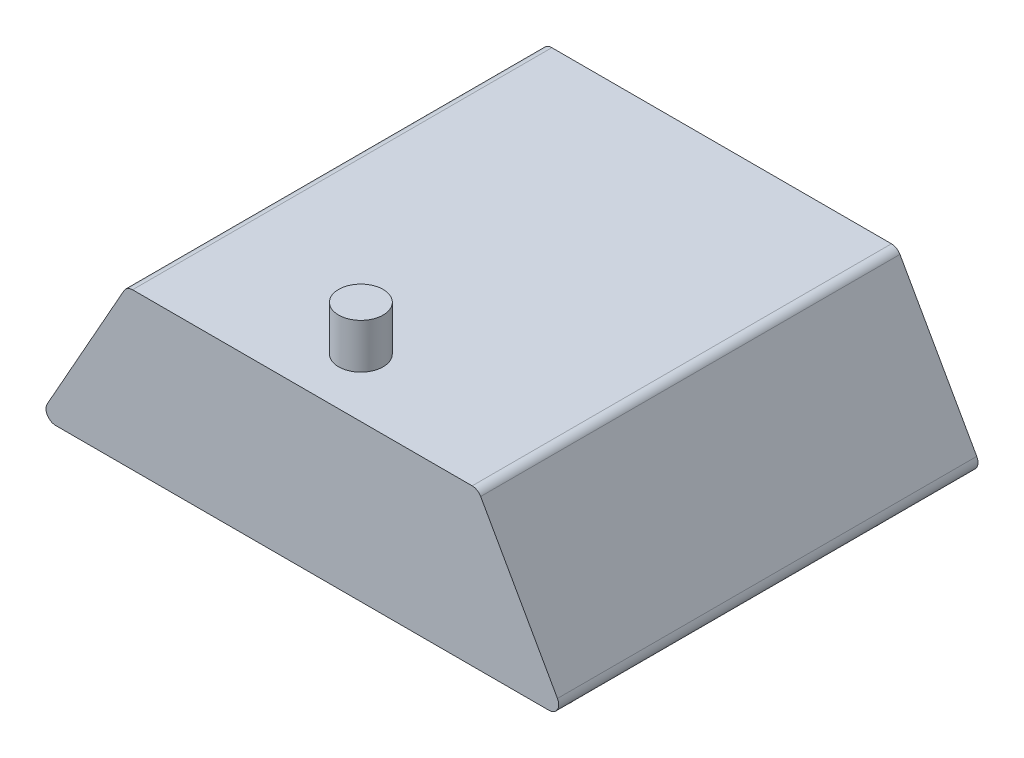
ISO-10303-21;
HEADER;
FILE_DESCRIPTION(('STEP AP214'),'2;1');
FILE_NAME('part.step','',(''),(''),'','','');
FILE_SCHEMA(('AUTOMOTIVE_DESIGN { 1 0 10303 214 1 1 1 1 }'));
ENDSEC;
DATA;
#1=APPLICATION_CONTEXT('core data for automotive mechanical design processes');
#2=APPLICATION_PROTOCOL_DEFINITION('international standard','automotive_design',2000,#1);
#3=PRODUCT_CONTEXT('',#1,'mechanical');
#4=PRODUCT('Part','Part','',(#3));
#5=PRODUCT_RELATED_PRODUCT_CATEGORY('part','',(#4));
#6=PRODUCT_DEFINITION_FORMATION('','',#4);
#7=PRODUCT_DEFINITION_CONTEXT('part definition',#1,'design');
#8=PRODUCT_DEFINITION('design','',#6,#7);
#9=PRODUCT_DEFINITION_SHAPE('','',#8);
#10=(LENGTH_UNIT() NAMED_UNIT(*) SI_UNIT(.MILLI.,.METRE.));
#11=(NAMED_UNIT(*) PLANE_ANGLE_UNIT() SI_UNIT($,.RADIAN.));
#12=(NAMED_UNIT(*) SI_UNIT($,.STERADIAN.) SOLID_ANGLE_UNIT());
#13=UNCERTAINTY_MEASURE_WITH_UNIT(LENGTH_MEASURE(1.E-05),#10,'distance_accuracy_value','');
#14=(GEOMETRIC_REPRESENTATION_CONTEXT(3) GLOBAL_UNCERTAINTY_ASSIGNED_CONTEXT((#13)) GLOBAL_UNIT_ASSIGNED_CONTEXT((#10,
#11,#12)) REPRESENTATION_CONTEXT('',''));
#15=CARTESIAN_POINT('',(0.,0.,0.));
#16=DIRECTION('',(0.,0.,1.));
#17=DIRECTION('',(1.,0.,0.));
#18=AXIS2_PLACEMENT_3D('',#15,#16,#17);
#19=CARTESIAN_POINT('',(-126.450762577911,-35.,215.));
#20=DIRECTION('',(0.,0.,-1.));
#21=DIRECTION('',(-1.,0.,0.));
#22=AXIS2_PLACEMENT_3D('',#19,#20,#21);
#23=CYLINDRICAL_SURFACE('',#22,5.00000000000003);
#24=CARTESIAN_POINT('',(-126.450762577911,-35.,0.));
#25=DIRECTION('',(0.,0.,1.));
#26=DIRECTION('',(1.,0.,0.));
#27=AXIS2_PLACEMENT_3D('',#24,#25,#26);
#28=CIRCLE('',#27,5.00000000000003);
#29=CARTESIAN_POINT('',(-130.808640263533,-32.5486938018372,0.));
#30=VERTEX_POINT('',#29);
#31=CARTESIAN_POINT('',(-126.450762577911,-40.,0.));
#32=VERTEX_POINT('',#31);
#33=EDGE_CURVE('E143',#30,#32,#28,.T.);
#34=ORIENTED_EDGE('',*,*,#33,.T.);
#35=DIRECTION('',(0.,0.,-1.));
#36=VECTOR('',#35,1.);
#37=CARTESIAN_POINT('',(-126.450762577911,-40.,215.));
#38=LINE('',#37,#36);
#39=CARTESIAN_POINT('',(-126.450762577911,-40.,215.));
#40=VERTEX_POINT('',#39);
#41=EDGE_CURVE('E185',#40,#32,#38,.T.);
#42=ORIENTED_EDGE('',*,*,#41,.F.);
#43=CARTESIAN_POINT('',(-126.450762577911,-35.,215.));
#44=DIRECTION('',(0.,0.,1.));
#45=DIRECTION('',(1.,0.,0.));
#46=AXIS2_PLACEMENT_3D('',#43,#44,#45);
#47=CIRCLE('',#46,5.00000000000003);
#48=CARTESIAN_POINT('',(-130.808640263533,-32.5486938018372,215.));
#49=VERTEX_POINT('',#48);
#50=EDGE_CURVE('E166',#49,#40,#47,.T.);
#51=ORIENTED_EDGE('',*,*,#50,.F.);
#52=DIRECTION('',(0.,0.,-1.));
#53=VECTOR('',#52,1.);
#54=CARTESIAN_POINT('',(-130.808640263533,-32.5486938018372,215.));
#55=LINE('',#54,#53);
#56=EDGE_CURVE('E139',#49,#30,#55,.T.);
#57=ORIENTED_EDGE('',*,*,#56,.T.);
#58=EDGE_LOOP('',(#34,#42,#51,#57));
#59=FACE_BOUND('',#58,.T.);
#60=ADVANCED_FACE('F41',(#59),#23,.T.);
#61=CARTESIAN_POINT('',(-126.450762577911,-40.,215.));
#62=DIRECTION('',(0.,1.,0.));
#63=DIRECTION('',(0.,0.,1.));
#64=AXIS2_PLACEMENT_3D('',#61,#62,#63);
#65=PLANE('',#64);
#66=CARTESIAN_POINT('',(100.,-40.,29.01));
#67=DIRECTION('',(0.,1.,0.));
#68=DIRECTION('',(0.,0.,1.));
#69=AXIS2_PLACEMENT_3D('',#66,#67,#68);
#70=CIRCLE('',#69,12.5);
#71=CARTESIAN_POINT('',(100.,-40.,41.51));
#72=VERTEX_POINT('',#71);
#73=EDGE_CURVE('E11',#72,#72,#70,.F.);
#74=ORIENTED_EDGE('',*,*,#73,.F.);
#75=EDGE_LOOP('',(#74));
#76=FACE_BOUND('',#75,.T.);
#77=CARTESIAN_POINT('',(100.,-40.,185.99));
#78=DIRECTION('',(0.,1.,0.));
#79=DIRECTION('',(0.,0.,1.));
#80=AXIS2_PLACEMENT_3D('',#77,#78,#79);
#81=CIRCLE('',#80,12.5);
#82=CARTESIAN_POINT('',(100.,-40.,198.49));
#83=VERTEX_POINT('',#82);
#84=EDGE_CURVE('E50',#83,#83,#81,.F.);
#85=ORIENTED_EDGE('',*,*,#84,.F.);
#86=EDGE_LOOP('',(#85));
#87=FACE_BOUND('',#86,.T.);
#88=CARTESIAN_POINT('',(-100.,-40.,185.99));
#89=DIRECTION('',(0.,1.,0.));
#90=DIRECTION('',(0.,0.,1.));
#91=AXIS2_PLACEMENT_3D('',#88,#89,#90);
#92=CIRCLE('',#91,12.5);
#93=CARTESIAN_POINT('',(-100.,-40.,198.49));
#94=VERTEX_POINT('',#93);
#95=EDGE_CURVE('E196',#94,#94,#92,.F.);
#96=ORIENTED_EDGE('',*,*,#95,.F.);
#97=EDGE_LOOP('',(#96));
#98=FACE_BOUND('',#97,.T.);
#99=CARTESIAN_POINT('',(-100.,-40.,29.01));
#100=DIRECTION('',(0.,1.,0.));
#101=DIRECTION('',(0.,0.,1.));
#102=AXIS2_PLACEMENT_3D('',#99,#100,#101);
#103=CIRCLE('',#102,12.5);
#104=CARTESIAN_POINT('',(-100.,-40.,41.51));
#105=VERTEX_POINT('',#104);
#106=EDGE_CURVE('E192',#105,#105,#103,.F.);
#107=ORIENTED_EDGE('',*,*,#106,.F.);
#108=EDGE_LOOP('',(#107));
#109=FACE_BOUND('',#108,.T.);
#110=DIRECTION('',(1.,0.,0.));
#111=VECTOR('',#110,1.);
#112=CARTESIAN_POINT('',(-126.450762577911,-40.,0.));
#113=LINE('',#112,#111);
#114=CARTESIAN_POINT('',(126.450762577911,-40.,0.));
#115=VERTEX_POINT('',#114);
#116=EDGE_CURVE('E147',#32,#115,#113,.T.);
#117=ORIENTED_EDGE('',*,*,#116,.T.);
#118=DIRECTION('',(0.,0.,-1.));
#119=VECTOR('',#118,1.);
#120=CARTESIAN_POINT('',(126.450762577911,-40.,215.));
#121=LINE('',#120,#119);
#122=CARTESIAN_POINT('',(126.450762577911,-40.,215.));
#123=VERTEX_POINT('',#122);
#124=EDGE_CURVE('E181',#123,#115,#121,.T.);
#125=ORIENTED_EDGE('',*,*,#124,.F.);
#126=DIRECTION('',(1.,0.,0.));
#127=VECTOR('',#126,1.);
#128=CARTESIAN_POINT('',(-126.450762577911,-40.,215.));
#129=LINE('',#128,#127);
#130=EDGE_CURVE('E102',#40,#123,#129,.T.);
#131=ORIENTED_EDGE('',*,*,#130,.F.);
#132=ORIENTED_EDGE('',*,*,#41,.T.);
#133=EDGE_LOOP('',(#117,#125,#131,#132));
#134=FACE_BOUND('',#133,.T.);
#135=ADVANCED_FACE('F205',(#76,#87,#98,#109,#134),#65,.F.);
#136=CARTESIAN_POINT('',(126.450762577911,-35.,215.));
#137=DIRECTION('',(0.,0.,-1.));
#138=DIRECTION('',(-1.,0.,0.));
#139=AXIS2_PLACEMENT_3D('',#136,#137,#138);
#140=CYLINDRICAL_SURFACE('',#139,5.);
#141=CARTESIAN_POINT('',(126.450762577911,-35.,0.));
#142=DIRECTION('',(0.,0.,1.));
#143=DIRECTION('',(1.,0.,0.));
#144=AXIS2_PLACEMENT_3D('',#141,#142,#143);
#145=CIRCLE('',#144,5.);
#146=CARTESIAN_POINT('',(130.808640263533,-32.5486938018372,0.));
#147=VERTEX_POINT('',#146);
#148=EDGE_CURVE('E151',#115,#147,#145,.T.);
#149=ORIENTED_EDGE('',*,*,#148,.T.);
#150=DIRECTION('',(0.,0.,-1.));
#151=VECTOR('',#150,1.);
#152=CARTESIAN_POINT('',(130.808640263533,-32.5486938018372,215.));
#153=LINE('',#152,#151);
#154=CARTESIAN_POINT('',(130.808640263533,-32.5486938018372,215.));
#155=VERTEX_POINT('',#154);
#156=EDGE_CURVE('E177',#155,#147,#153,.T.);
#157=ORIENTED_EDGE('',*,*,#156,.F.);
#158=CARTESIAN_POINT('',(126.450762577911,-35.,215.));
#159=DIRECTION('',(0.,0.,1.));
#160=DIRECTION('',(1.,0.,0.));
#161=AXIS2_PLACEMENT_3D('',#158,#159,#160);
#162=CIRCLE('',#161,5.);
#163=EDGE_CURVE('E220',#123,#155,#162,.T.);
#164=ORIENTED_EDGE('',*,*,#163,.F.);
#165=ORIENTED_EDGE('',*,*,#124,.T.);
#166=EDGE_LOOP('',(#149,#157,#164,#165));
#167=FACE_BOUND('',#166,.T.);
#168=ADVANCED_FACE('F208',(#167),#140,.T.);
#169=CARTESIAN_POINT('',(91.4336402635334,37.4513061981628,215.));
#170=DIRECTION('',(-0.871575537124549,-0.490261239632559,0.));
#171=DIRECTION('',(0.490261239632559,-0.871575537124549,0.));
#172=AXIS2_PLACEMENT_3D('',#169,#170,#171);
#173=PLANE('',#172);
#174=DIRECTION('',(-0.490261239632559,0.871575537124549,0.));
#175=VECTOR('',#174,1.);
#176=CARTESIAN_POINT('',(91.4336402635334,37.4513061981628,0.));
#177=LINE('',#176,#175);
#178=CARTESIAN_POINT('',(91.4336402635334,37.4513061981628,0.));
#179=VERTEX_POINT('',#178);
#180=EDGE_CURVE('E154',#147,#179,#177,.T.);
#181=ORIENTED_EDGE('',*,*,#180,.T.);
#182=DIRECTION('',(0.,0.,-1.));
#183=VECTOR('',#182,1.);
#184=CARTESIAN_POINT('',(91.4336402635334,37.4513061981628,215.));
#185=LINE('',#184,#183);
#186=CARTESIAN_POINT('',(91.4336402635334,37.4513061981628,215.));
#187=VERTEX_POINT('',#186);
#188=EDGE_CURVE('E173',#187,#179,#185,.T.);
#189=ORIENTED_EDGE('',*,*,#188,.F.);
#190=DIRECTION('',(-0.490261239632559,0.871575537124549,0.));
#191=VECTOR('',#190,1.);
#192=CARTESIAN_POINT('',(91.4336402635334,37.4513061981628,215.));
#193=LINE('',#192,#191);
#194=EDGE_CURVE('E231',#155,#187,#193,.T.);
#195=ORIENTED_EDGE('',*,*,#194,.F.);
#196=ORIENTED_EDGE('',*,*,#156,.T.);
#197=EDGE_LOOP('',(#181,#189,#195,#196));
#198=FACE_BOUND('',#197,.T.);
#199=ADVANCED_FACE('F226',(#198),#173,.F.);
#200=CARTESIAN_POINT('',(87.0757625779107,35.,215.));
#201=DIRECTION('',(0.,0.,-1.));
#202=DIRECTION('',(-1.,0.,0.));
#203=AXIS2_PLACEMENT_3D('',#200,#201,#202);
#204=CYLINDRICAL_SURFACE('',#203,5.00000000000002);
#205=CARTESIAN_POINT('',(87.0757625779107,35.,0.));
#206=DIRECTION('',(0.,0.,1.));
#207=DIRECTION('',(-1.,0.,0.));
#208=AXIS2_PLACEMENT_3D('',#205,#206,#207);
#209=CIRCLE('',#208,5.00000000000002);
#210=CARTESIAN_POINT('',(87.0757625779107,40.,0.));
#211=VERTEX_POINT('',#210);
#212=EDGE_CURVE('E157',#179,#211,#209,.T.);
#213=ORIENTED_EDGE('',*,*,#212,.T.);
#214=DIRECTION('',(0.,0.,-1.));
#215=VECTOR('',#214,1.);
#216=CARTESIAN_POINT('',(87.0757625779107,40.,215.));
#217=LINE('',#216,#215);
#218=CARTESIAN_POINT('',(87.0757625779107,40.,215.));
#219=VERTEX_POINT('',#218);
#220=EDGE_CURVE('E132',#219,#211,#217,.T.);
#221=ORIENTED_EDGE('',*,*,#220,.F.);
#222=CARTESIAN_POINT('',(87.0757625779107,35.,215.));
#223=DIRECTION('',(0.,0.,1.));
#224=DIRECTION('',(-1.,0.,0.));
#225=AXIS2_PLACEMENT_3D('',#222,#223,#224);
#226=CIRCLE('',#225,5.00000000000002);
#227=EDGE_CURVE('E121',#187,#219,#226,.T.);
#228=ORIENTED_EDGE('',*,*,#227,.F.);
#229=ORIENTED_EDGE('',*,*,#188,.T.);
#230=EDGE_LOOP('',(#213,#221,#228,#229));
#231=FACE_BOUND('',#230,.T.);
#232=ADVANCED_FACE('F229',(#231),#204,.T.);
#233=CARTESIAN_POINT('',(-87.0757625779107,40.,215.));
#234=DIRECTION('',(0.,-1.,0.));
#235=DIRECTION('',(0.,0.,-1.));
#236=AXIS2_PLACEMENT_3D('',#233,#234,#235);
#237=PLANE('',#236);
#238=CARTESIAN_POINT('',(0.,40.,185.));
#239=DIRECTION('',(0.,-1.,0.));
#240=DIRECTION('',(0.,0.,-1.));
#241=AXIS2_PLACEMENT_3D('',#238,#239,#240);
#242=CIRCLE('',#241,11.405);
#243=CARTESIAN_POINT('',(0.,40.,173.595));
#244=VERTEX_POINT('',#243);
#245=EDGE_CURVE('E188',#244,#244,#242,.F.);
#246=ORIENTED_EDGE('',*,*,#245,.F.);
#247=EDGE_LOOP('',(#246));
#248=FACE_BOUND('',#247,.T.);
#249=DIRECTION('',(-1.,0.,0.));
#250=VECTOR('',#249,1.);
#251=CARTESIAN_POINT('',(-87.0757625779107,40.,0.));
#252=LINE('',#251,#250);
#253=CARTESIAN_POINT('',(-87.0757625779107,40.,0.));
#254=VERTEX_POINT('',#253);
#255=EDGE_CURVE('E130',#211,#254,#252,.T.);
#256=ORIENTED_EDGE('',*,*,#255,.T.);
#257=DIRECTION('',(0.,0.,-1.));
#258=VECTOR('',#257,1.);
#259=CARTESIAN_POINT('',(-87.0757625779107,40.,215.));
#260=LINE('',#259,#258);
#261=CARTESIAN_POINT('',(-87.0757625779107,40.,215.));
#262=VERTEX_POINT('',#261);
#263=EDGE_CURVE('E127',#262,#254,#260,.T.);
#264=ORIENTED_EDGE('',*,*,#263,.F.);
#265=DIRECTION('',(-1.,0.,0.));
#266=VECTOR('',#265,1.);
#267=CARTESIAN_POINT('',(-87.0757625779107,40.,215.));
#268=LINE('',#267,#266);
#269=EDGE_CURVE('E115',#219,#262,#268,.T.);
#270=ORIENTED_EDGE('',*,*,#269,.F.);
#271=ORIENTED_EDGE('',*,*,#220,.T.);
#272=EDGE_LOOP('',(#256,#264,#270,#271));
#273=FACE_BOUND('',#272,.T.);
#274=ADVANCED_FACE('F128',(#248,#273),#237,.F.);
#275=CARTESIAN_POINT('',(-87.0757625779107,35.,215.));
#276=DIRECTION('',(0.,0.,-1.));
#277=DIRECTION('',(-1.,0.,0.));
#278=AXIS2_PLACEMENT_3D('',#275,#276,#277);
#279=CYLINDRICAL_SURFACE('',#278,4.99999999999999);
#280=CARTESIAN_POINT('',(-87.0757625779107,35.,0.));
#281=DIRECTION('',(0.,0.,1.));
#282=DIRECTION('',(-1.,0.,0.));
#283=AXIS2_PLACEMENT_3D('',#280,#281,#282);
#284=CIRCLE('',#283,4.99999999999999);
#285=CARTESIAN_POINT('',(-91.4336402635334,37.4513061981628,0.));
#286=VERTEX_POINT('',#285);
#287=EDGE_CURVE('E87',#254,#286,#284,.T.);
#288=ORIENTED_EDGE('',*,*,#287,.T.);
#289=DIRECTION('',(0.,0.,-1.));
#290=VECTOR('',#289,1.);
#291=CARTESIAN_POINT('',(-91.4336402635334,37.4513061981628,215.));
#292=LINE('',#291,#290);
#293=CARTESIAN_POINT('',(-91.4336402635334,37.4513061981628,215.));
#294=VERTEX_POINT('',#293);
#295=EDGE_CURVE('E133',#294,#286,#292,.T.);
#296=ORIENTED_EDGE('',*,*,#295,.F.);
#297=CARTESIAN_POINT('',(-87.0757625779107,35.,215.));
#298=DIRECTION('',(0.,0.,1.));
#299=DIRECTION('',(-1.,0.,0.));
#300=AXIS2_PLACEMENT_3D('',#297,#298,#299);
#301=CIRCLE('',#300,4.99999999999999);
#302=EDGE_CURVE('E119',#262,#294,#301,.T.);
#303=ORIENTED_EDGE('',*,*,#302,.F.);
#304=ORIENTED_EDGE('',*,*,#263,.T.);
#305=EDGE_LOOP('',(#288,#296,#303,#304));
#306=FACE_BOUND('',#305,.T.);
#307=ADVANCED_FACE('F135',(#306),#279,.T.);
#308=CARTESIAN_POINT('',(-91.4336402635334,37.4513061981628,215.));
#309=DIRECTION('',(0.871575537124549,-0.490261239632559,0.));
#310=DIRECTION('',(0.490261239632559,0.871575537124549,0.));
#311=AXIS2_PLACEMENT_3D('',#308,#309,#310);
#312=PLANE('',#311);
#313=DIRECTION('',(-0.490261239632559,-0.871575537124549,0.));
#314=VECTOR('',#313,1.);
#315=CARTESIAN_POINT('',(-91.4336402635334,37.4513061981628,0.));
#316=LINE('',#315,#314);
#317=EDGE_CURVE('E93',#286,#30,#316,.T.);
#318=ORIENTED_EDGE('',*,*,#317,.T.);
#319=ORIENTED_EDGE('',*,*,#56,.F.);
#320=DIRECTION('',(-0.490261239632559,-0.871575537124549,0.));
#321=VECTOR('',#320,1.);
#322=CARTESIAN_POINT('',(-91.4336402635334,37.4513061981628,215.));
#323=LINE('',#322,#321);
#324=EDGE_CURVE('E58',#294,#49,#323,.T.);
#325=ORIENTED_EDGE('',*,*,#324,.F.);
#326=ORIENTED_EDGE('',*,*,#295,.T.);
#327=EDGE_LOOP('',(#318,#319,#325,#326));
#328=FACE_BOUND('',#327,.T.);
#329=ADVANCED_FACE('F284',(#328),#312,.F.);
#330=CARTESIAN_POINT('',(-126.450762577911,-35.,215.));
#331=DIRECTION('',(0.,0.,1.));
#332=DIRECTION('',(1.,0.,0.));
#333=AXIS2_PLACEMENT_3D('',#330,#331,#332);
#334=PLANE('',#333);
#335=ORIENTED_EDGE('',*,*,#50,.T.);
#336=ORIENTED_EDGE('',*,*,#130,.T.);
#337=ORIENTED_EDGE('',*,*,#163,.T.);
#338=ORIENTED_EDGE('',*,*,#194,.T.);
#339=ORIENTED_EDGE('',*,*,#227,.T.);
#340=ORIENTED_EDGE('',*,*,#269,.T.);
#341=ORIENTED_EDGE('',*,*,#302,.T.);
#342=ORIENTED_EDGE('',*,*,#324,.T.);
#343=EDGE_LOOP('',(#335,#336,#337,#338,#339,#340,#341,#342));
#344=FACE_BOUND('',#343,.T.);
#345=ADVANCED_FACE('F117',(#344),#334,.T.);
#346=CARTESIAN_POINT('',(-126.450762577911,-35.,0.));
#347=DIRECTION('',(0.,0.,1.));
#348=DIRECTION('',(1.,0.,0.));
#349=AXIS2_PLACEMENT_3D('',#346,#347,#348);
#350=PLANE('',#349);
#351=ORIENTED_EDGE('',*,*,#33,.F.);
#352=ORIENTED_EDGE('',*,*,#317,.F.);
#353=ORIENTED_EDGE('',*,*,#287,.F.);
#354=ORIENTED_EDGE('',*,*,#255,.F.);
#355=ORIENTED_EDGE('',*,*,#212,.F.);
#356=ORIENTED_EDGE('',*,*,#180,.F.);
#357=ORIENTED_EDGE('',*,*,#148,.F.);
#358=ORIENTED_EDGE('',*,*,#116,.F.);
#359=EDGE_LOOP('',(#351,#352,#353,#354,#355,#356,#357,#358));
#360=FACE_BOUND('',#359,.T.);
#361=ADVANCED_FACE('F222',(#360),#350,.F.);
#362=CARTESIAN_POINT('',(0.,60.,185.));
#363=DIRECTION('',(0.,-1.,0.));
#364=DIRECTION('',(0.,0.,-1.));
#365=AXIS2_PLACEMENT_3D('',#362,#363,#364);
#366=CYLINDRICAL_SURFACE('',#365,11.405);
#367=ORIENTED_EDGE('',*,*,#245,.T.);
#368=EDGE_LOOP('',(#367));
#369=FACE_BOUND('',#368,.T.);
#370=CARTESIAN_POINT('',(0.,63.,185.));
#371=DIRECTION('',(0.,1.,0.));
#372=DIRECTION('',(0.,0.,1.));
#373=AXIS2_PLACEMENT_3D('',#370,#371,#372);
#374=CIRCLE('',#373,11.405);
#375=CARTESIAN_POINT('',(0.,63.,196.405));
#376=VERTEX_POINT('',#375);
#377=EDGE_CURVE('E256',#376,#376,#374,.T.);
#378=ORIENTED_EDGE('',*,*,#377,.F.);
#379=EDGE_LOOP('',(#378));
#380=FACE_BOUND('',#379,.T.);
#381=ADVANCED_FACE('F263',(#369,#380),#366,.T.);
#382=CARTESIAN_POINT('',(-100.,-40.,29.01));
#383=DIRECTION('',(0.,1.,0.));
#384=DIRECTION('',(0.,0.,-1.));
#385=AXIS2_PLACEMENT_3D('',#382,#383,#384);
#386=CONICAL_SURFACE('',#385,12.5,0.191986217719377);
#387=CARTESIAN_POINT('',(-100.,-60.,29.01));
#388=DIRECTION('',(0.,-1.,0.));
#389=DIRECTION('',(0.,0.,-1.));
#390=AXIS2_PLACEMENT_3D('',#387,#388,#389);
#391=CIRCLE('',#390,8.61239381724562);
#392=CARTESIAN_POINT('',(-100.,-60.,20.3976061827544));
#393=VERTEX_POINT('',#392);
#394=EDGE_CURVE('E148',#393,#393,#391,.T.);
#395=ORIENTED_EDGE('',*,*,#394,.F.);
#396=EDGE_LOOP('',(#395));
#397=FACE_BOUND('',#396,.T.);
#398=ORIENTED_EDGE('',*,*,#106,.T.);
#399=EDGE_LOOP('',(#398));
#400=FACE_BOUND('',#399,.T.);
#401=ADVANCED_FACE('F265',(#397,#400),#386,.T.);
#402=CARTESIAN_POINT('',(0.,-60.,0.));
#403=DIRECTION('',(0.,-1.,0.));
#404=DIRECTION('',(0.,0.,-1.));
#405=AXIS2_PLACEMENT_3D('',#402,#403,#404);
#406=PLANE('',#405);
#407=ORIENTED_EDGE('',*,*,#394,.T.);
#408=EDGE_LOOP('',(#407));
#409=FACE_BOUND('',#408,.T.);
#410=ADVANCED_FACE('F273',(#409),#406,.T.);
#411=CARTESIAN_POINT('',(-100.,-40.,185.99));
#412=DIRECTION('',(0.,1.,0.));
#413=DIRECTION('',(0.,0.,-1.));
#414=AXIS2_PLACEMENT_3D('',#411,#412,#413);
#415=CONICAL_SURFACE('',#414,12.5,0.191986217719377);
#416=CARTESIAN_POINT('',(-100.,-60.,185.99));
#417=DIRECTION('',(0.,-1.,0.));
#418=DIRECTION('',(0.,0.,-1.));
#419=AXIS2_PLACEMENT_3D('',#416,#417,#418);
#420=CIRCLE('',#419,8.61239381724563);
#421=CARTESIAN_POINT('',(-100.,-60.,177.377606182754));
#422=VERTEX_POINT('',#421);
#423=EDGE_CURVE('E244',#422,#422,#420,.T.);
#424=ORIENTED_EDGE('',*,*,#423,.F.);
#425=EDGE_LOOP('',(#424));
#426=FACE_BOUND('',#425,.T.);
#427=ORIENTED_EDGE('',*,*,#95,.T.);
#428=EDGE_LOOP('',(#427));
#429=FACE_BOUND('',#428,.T.);
#430=ADVANCED_FACE('F350',(#426,#429),#415,.T.);
#431=CARTESIAN_POINT('',(0.,-60.,0.));
#432=DIRECTION('',(0.,-1.,0.));
#433=DIRECTION('',(0.,0.,-1.));
#434=AXIS2_PLACEMENT_3D('',#431,#432,#433);
#435=PLANE('',#434);
#436=ORIENTED_EDGE('',*,*,#423,.T.);
#437=EDGE_LOOP('',(#436));
#438=FACE_BOUND('',#437,.T.);
#439=ADVANCED_FACE('F358',(#438),#435,.T.);
#440=CARTESIAN_POINT('',(100.,-40.,185.99));
#441=DIRECTION('',(0.,1.,0.));
#442=DIRECTION('',(0.,0.,-1.));
#443=AXIS2_PLACEMENT_3D('',#440,#441,#442);
#444=CONICAL_SURFACE('',#443,12.5,0.191986217719377);
#445=CARTESIAN_POINT('',(100.,-60.,185.99));
#446=DIRECTION('',(0.,-1.,0.));
#447=DIRECTION('',(0.,0.,-1.));
#448=AXIS2_PLACEMENT_3D('',#445,#446,#447);
#449=CIRCLE('',#448,8.61239381724563);
#450=CARTESIAN_POINT('',(100.,-60.,177.377606182754));
#451=VERTEX_POINT('',#450);
#452=EDGE_CURVE('E248',#451,#451,#449,.T.);
#453=ORIENTED_EDGE('',*,*,#452,.F.);
#454=EDGE_LOOP('',(#453));
#455=FACE_BOUND('',#454,.T.);
#456=ORIENTED_EDGE('',*,*,#84,.T.);
#457=EDGE_LOOP('',(#456));
#458=FACE_BOUND('',#457,.T.);
#459=ADVANCED_FACE('F203',(#455,#458),#444,.T.);
#460=CARTESIAN_POINT('',(0.,-60.,0.));
#461=DIRECTION('',(0.,-1.,0.));
#462=DIRECTION('',(0.,0.,-1.));
#463=AXIS2_PLACEMENT_3D('',#460,#461,#462);
#464=PLANE('',#463);
#465=ORIENTED_EDGE('',*,*,#452,.T.);
#466=EDGE_LOOP('',(#465));
#467=FACE_BOUND('',#466,.T.);
#468=ADVANCED_FACE('F373',(#467),#464,.T.);
#469=CARTESIAN_POINT('',(100.,-40.,29.01));
#470=DIRECTION('',(0.,1.,0.));
#471=DIRECTION('',(0.,0.,-1.));
#472=AXIS2_PLACEMENT_3D('',#469,#470,#471);
#473=CONICAL_SURFACE('',#472,12.5,0.191986217719377);
#474=CARTESIAN_POINT('',(100.,-60.,29.01));
#475=DIRECTION('',(0.,-1.,0.));
#476=DIRECTION('',(0.,0.,-1.));
#477=AXIS2_PLACEMENT_3D('',#474,#475,#476);
#478=CIRCLE('',#477,8.61239381724562);
#479=CARTESIAN_POINT('',(100.,-60.,20.3976061827544));
#480=VERTEX_POINT('',#479);
#481=EDGE_CURVE('E252',#480,#480,#478,.T.);
#482=ORIENTED_EDGE('',*,*,#481,.F.);
#483=EDGE_LOOP('',(#482));
#484=FACE_BOUND('',#483,.T.);
#485=ORIENTED_EDGE('',*,*,#73,.T.);
#486=EDGE_LOOP('',(#485));
#487=FACE_BOUND('',#486,.T.);
#488=ADVANCED_FACE('F381',(#484,#487),#473,.T.);
#489=CARTESIAN_POINT('',(0.,-60.,0.));
#490=DIRECTION('',(0.,-1.,0.));
#491=DIRECTION('',(0.,0.,-1.));
#492=AXIS2_PLACEMENT_3D('',#489,#490,#491);
#493=PLANE('',#492);
#494=ORIENTED_EDGE('',*,*,#481,.T.);
#495=EDGE_LOOP('',(#494));
#496=FACE_BOUND('',#495,.T.);
#497=ADVANCED_FACE('F388',(#496),#493,.T.);
#498=CARTESIAN_POINT('',(0.,63.,185.));
#499=DIRECTION('',(0.,1.,0.));
#500=DIRECTION('',(0.,0.,1.));
#501=AXIS2_PLACEMENT_3D('',#498,#499,#500);
#502=PLANE('',#501);
#503=ORIENTED_EDGE('',*,*,#377,.T.);
#504=EDGE_LOOP('',(#503));
#505=FACE_BOUND('',#504,.T.);
#506=ADVANCED_FACE('F261',(#505),#502,.T.);
#507=CLOSED_SHELL('',(#60,#135,#168,#199,#232,#274,#307,#329,#345,#361,#381,#401,#410,#430,#439,
#459,#468,#488,#497,#506));
#508=MANIFOLD_SOLID_BREP('B2',#507);
#509=ADVANCED_BREP_SHAPE_REPRESENTATION('',(#18,#508),#14);
#510=SHAPE_DEFINITION_REPRESENTATION(#9,#509);
ENDSEC;
END-ISO-10303-21;
